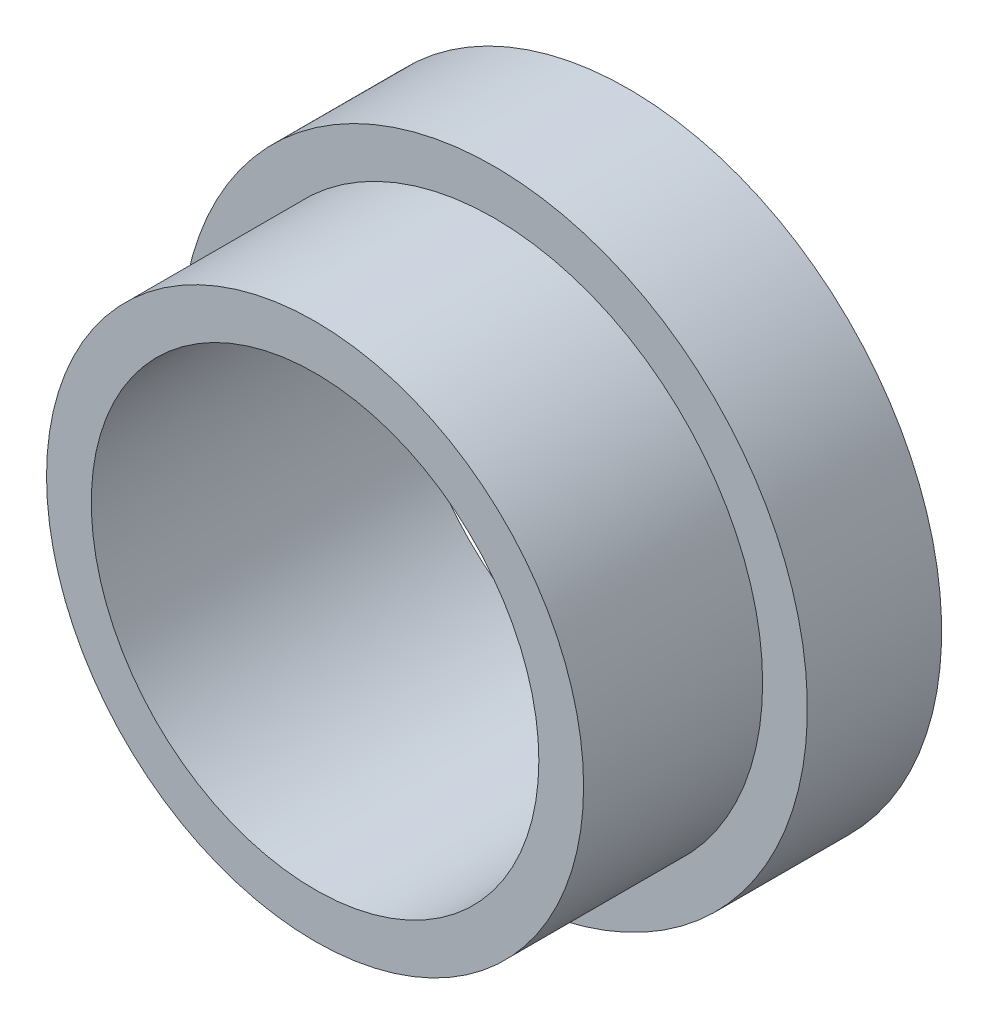
ISO-10303-21;
HEADER;
FILE_DESCRIPTION(('STEP AP214'),'2;1');
FILE_NAME('part.step','',(''),(''),'','','');
FILE_SCHEMA(('AUTOMOTIVE_DESIGN { 1 0 10303 214 1 1 1 1 }'));
ENDSEC;
DATA;
#1=APPLICATION_CONTEXT('core data for automotive mechanical design processes');
#2=APPLICATION_PROTOCOL_DEFINITION('international standard','automotive_design',2000,#1);
#3=PRODUCT_CONTEXT('',#1,'mechanical');
#4=PRODUCT('Part','Part','',(#3));
#5=PRODUCT_RELATED_PRODUCT_CATEGORY('part','',(#4));
#6=PRODUCT_DEFINITION_FORMATION('','',#4);
#7=PRODUCT_DEFINITION_CONTEXT('part definition',#1,'design');
#8=PRODUCT_DEFINITION('design','',#6,#7);
#9=PRODUCT_DEFINITION_SHAPE('','',#8);
#10=(LENGTH_UNIT() NAMED_UNIT(*) SI_UNIT(.MILLI.,.METRE.));
#11=(NAMED_UNIT(*) PLANE_ANGLE_UNIT() SI_UNIT($,.RADIAN.));
#12=(NAMED_UNIT(*) SI_UNIT($,.STERADIAN.) SOLID_ANGLE_UNIT());
#13=UNCERTAINTY_MEASURE_WITH_UNIT(LENGTH_MEASURE(1.E-05),#10,'distance_accuracy_value','');
#14=(GEOMETRIC_REPRESENTATION_CONTEXT(3) GLOBAL_UNCERTAINTY_ASSIGNED_CONTEXT((#13)) GLOBAL_UNIT_ASSIGNED_CONTEXT((#10,
#11,#12)) REPRESENTATION_CONTEXT('',''));
#15=CARTESIAN_POINT('',(0.,0.,0.));
#16=DIRECTION('',(0.,0.,1.));
#17=DIRECTION('',(1.,0.,0.));
#18=AXIS2_PLACEMENT_3D('',#15,#16,#17);
#19=CARTESIAN_POINT('',(0.,0.,7.));
#20=DIRECTION('',(0.,0.,-1.));
#21=DIRECTION('',(-1.,0.,0.));
#22=AXIS2_PLACEMENT_3D('',#19,#20,#21);
#23=CYLINDRICAL_SURFACE('',#22,6.);
#24=CARTESIAN_POINT('',(0.,0.,7.));
#25=DIRECTION('',(0.,0.,1.));
#26=DIRECTION('',(1.,0.,0.));
#27=AXIS2_PLACEMENT_3D('',#24,#25,#26);
#28=CIRCLE('',#27,6.);
#29=CARTESIAN_POINT('',(6.,0.,7.));
#30=VERTEX_POINT('',#29);
#31=EDGE_CURVE('E43',#30,#30,#28,.T.);
#32=ORIENTED_EDGE('',*,*,#31,.F.);
#33=EDGE_LOOP('',(#32));
#34=FACE_BOUND('',#33,.T.);
#35=CARTESIAN_POINT('',(0.,0.,3.));
#36=DIRECTION('',(0.,0.,-1.));
#37=DIRECTION('',(-1.,0.,0.));
#38=AXIS2_PLACEMENT_3D('',#35,#36,#37);
#39=CIRCLE('',#38,6.);
#40=CARTESIAN_POINT('',(-6.,0.,3.));
#41=VERTEX_POINT('',#40);
#42=EDGE_CURVE('E10',#41,#41,#39,.T.);
#43=ORIENTED_EDGE('',*,*,#42,.F.);
#44=EDGE_LOOP('',(#43));
#45=FACE_BOUND('',#44,.T.);
#46=ADVANCED_FACE('F37',(#34,#45),#23,.T.);
#47=CARTESIAN_POINT('',(0.,0.,7.));
#48=DIRECTION('',(0.,0.,1.));
#49=DIRECTION('',(1.,0.,0.));
#50=AXIS2_PLACEMENT_3D('',#47,#48,#49);
#51=PLANE('',#50);
#52=ORIENTED_EDGE('',*,*,#31,.T.);
#53=EDGE_LOOP('',(#52));
#54=FACE_BOUND('',#53,.T.);
#55=CARTESIAN_POINT('',(0.,0.,7.));
#56=DIRECTION('',(0.,0.,1.));
#57=DIRECTION('',(1.,0.,0.));
#58=AXIS2_PLACEMENT_3D('',#55,#56,#57);
#59=CIRCLE('',#58,5.);
#60=CARTESIAN_POINT('',(5.,0.,7.));
#61=VERTEX_POINT('',#60);
#62=EDGE_CURVE('E47',#61,#61,#59,.T.);
#63=ORIENTED_EDGE('',*,*,#62,.F.);
#64=EDGE_LOOP('',(#63));
#65=FACE_BOUND('',#64,.T.);
#66=ADVANCED_FACE('F75',(#54,#65),#51,.T.);
#67=CARTESIAN_POINT('',(0.,0.,0.));
#68=DIRECTION('',(0.,0.,1.));
#69=DIRECTION('',(1.,0.,0.));
#70=AXIS2_PLACEMENT_3D('',#67,#68,#69);
#71=PLANE('',#70);
#72=CARTESIAN_POINT('',(0.,0.,0.));
#73=DIRECTION('',(0.,0.,1.));
#74=DIRECTION('',(1.,0.,0.));
#75=AXIS2_PLACEMENT_3D('',#72,#73,#74);
#76=CIRCLE('',#75,5.);
#77=CARTESIAN_POINT('',(5.,0.,0.));
#78=VERTEX_POINT('',#77);
#79=EDGE_CURVE('E51',#78,#78,#76,.T.);
#80=ORIENTED_EDGE('',*,*,#79,.T.);
#81=EDGE_LOOP('',(#80));
#82=FACE_BOUND('',#81,.T.);
#83=CARTESIAN_POINT('',(0.,0.,0.));
#84=DIRECTION('',(0.,0.,-1.));
#85=DIRECTION('',(-1.,0.,0.));
#86=AXIS2_PLACEMENT_3D('',#83,#84,#85);
#87=CIRCLE('',#86,7.);
#88=CARTESIAN_POINT('',(-7.,0.,0.));
#89=VERTEX_POINT('',#88);
#90=EDGE_CURVE('E57',#89,#89,#87,.T.);
#91=ORIENTED_EDGE('',*,*,#90,.T.);
#92=EDGE_LOOP('',(#91));
#93=FACE_BOUND('',#92,.T.);
#94=ADVANCED_FACE('F80',(#82,#93),#71,.F.);
#95=CARTESIAN_POINT('',(0.,0.,7.));
#96=DIRECTION('',(0.,0.,-1.));
#97=DIRECTION('',(-1.,0.,0.));
#98=AXIS2_PLACEMENT_3D('',#95,#96,#97);
#99=CYLINDRICAL_SURFACE('',#98,5.);
#100=ORIENTED_EDGE('',*,*,#62,.T.);
#101=EDGE_LOOP('',(#100));
#102=FACE_BOUND('',#101,.T.);
#103=ORIENTED_EDGE('',*,*,#79,.F.);
#104=EDGE_LOOP('',(#103));
#105=FACE_BOUND('',#104,.T.);
#106=ADVANCED_FACE('F72',(#102,#105),#99,.F.);
#107=CARTESIAN_POINT('',(0.,0.,3.));
#108=DIRECTION('',(0.,0.,-1.));
#109=DIRECTION('',(-1.,0.,0.));
#110=AXIS2_PLACEMENT_3D('',#107,#108,#109);
#111=CYLINDRICAL_SURFACE('',#110,7.);
#112=CARTESIAN_POINT('',(0.,0.,3.));
#113=DIRECTION('',(0.,0.,-1.));
#114=DIRECTION('',(-1.,0.,0.));
#115=AXIS2_PLACEMENT_3D('',#112,#113,#114);
#116=CIRCLE('',#115,7.);
#117=CARTESIAN_POINT('',(-7.,0.,3.));
#118=VERTEX_POINT('',#117);
#119=EDGE_CURVE('E55',#118,#118,#116,.T.);
#120=ORIENTED_EDGE('',*,*,#119,.T.);
#121=EDGE_LOOP('',(#120));
#122=FACE_BOUND('',#121,.T.);
#123=ORIENTED_EDGE('',*,*,#90,.F.);
#124=EDGE_LOOP('',(#123));
#125=FACE_BOUND('',#124,.T.);
#126=ADVANCED_FACE('F63',(#122,#125),#111,.T.);
#127=CARTESIAN_POINT('',(0.,0.,3.));
#128=DIRECTION('',(0.,0.,-1.));
#129=DIRECTION('',(-1.,0.,0.));
#130=AXIS2_PLACEMENT_3D('',#127,#128,#129);
#131=PLANE('',#130);
#132=ORIENTED_EDGE('',*,*,#42,.T.);
#133=EDGE_LOOP('',(#132));
#134=FACE_BOUND('',#133,.T.);
#135=ORIENTED_EDGE('',*,*,#119,.F.);
#136=EDGE_LOOP('',(#135));
#137=FACE_BOUND('',#136,.T.);
#138=ADVANCED_FACE('F66',(#134,#137),#131,.F.);
#139=CLOSED_SHELL('',(#46,#66,#94,#106,#126,#138));
#140=MANIFOLD_SOLID_BREP('B2',#139);
#141=ADVANCED_BREP_SHAPE_REPRESENTATION('',(#18,#140),#14);
#142=SHAPE_DEFINITION_REPRESENTATION(#9,#141);
ENDSEC;
END-ISO-10303-21;
